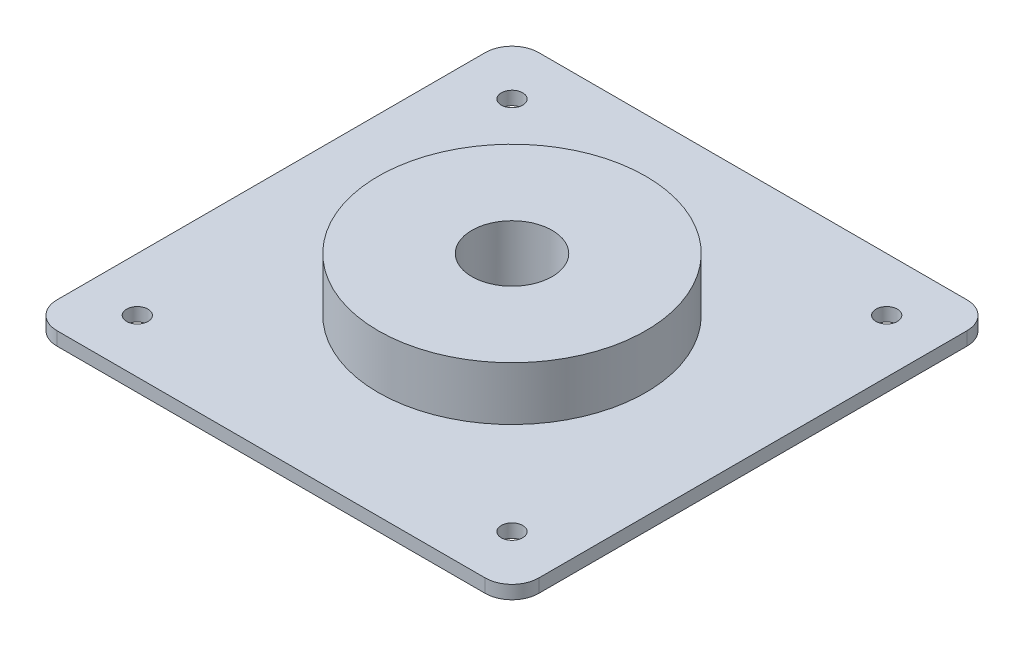
ISO-10303-21;
HEADER;
FILE_DESCRIPTION(('STEP AP214'),'2;1');
FILE_NAME('part.step','',(''),(''),'','','');
FILE_SCHEMA(('AUTOMOTIVE_DESIGN { 1 0 10303 214 1 1 1 1 }'));
ENDSEC;
DATA;
#1=APPLICATION_CONTEXT('core data for automotive mechanical design processes');
#2=APPLICATION_PROTOCOL_DEFINITION('international standard','automotive_design',2000,#1);
#3=PRODUCT_CONTEXT('',#1,'mechanical');
#4=PRODUCT('Part','Part','',(#3));
#5=PRODUCT_RELATED_PRODUCT_CATEGORY('part','',(#4));
#6=PRODUCT_DEFINITION_FORMATION('','',#4);
#7=PRODUCT_DEFINITION_CONTEXT('part definition',#1,'design');
#8=PRODUCT_DEFINITION('design','',#6,#7);
#9=PRODUCT_DEFINITION_SHAPE('','',#8);
#10=(LENGTH_UNIT() NAMED_UNIT(*) SI_UNIT(.MILLI.,.METRE.));
#11=(NAMED_UNIT(*) PLANE_ANGLE_UNIT() SI_UNIT($,.RADIAN.));
#12=(NAMED_UNIT(*) SI_UNIT($,.STERADIAN.) SOLID_ANGLE_UNIT());
#13=UNCERTAINTY_MEASURE_WITH_UNIT(LENGTH_MEASURE(1.E-05),#10,'distance_accuracy_value','');
#14=(GEOMETRIC_REPRESENTATION_CONTEXT(3) GLOBAL_UNCERTAINTY_ASSIGNED_CONTEXT((#13)) GLOBAL_UNIT_ASSIGNED_CONTEXT((#10,
#11,#12)) REPRESENTATION_CONTEXT('',''));
#15=CARTESIAN_POINT('',(0.,0.,0.));
#16=DIRECTION('',(0.,0.,1.));
#17=DIRECTION('',(1.,0.,0.));
#18=AXIS2_PLACEMENT_3D('',#15,#16,#17);
#19=CARTESIAN_POINT('',(160.,-5.,-160.));
#20=DIRECTION('',(0.,1.,0.));
#21=DIRECTION('',(0.,0.,1.));
#22=AXIS2_PLACEMENT_3D('',#19,#20,#21);
#23=CYLINDRICAL_SURFACE('',#22,4.);
#24=CARTESIAN_POINT('',(160.,0.,-160.));
#25=DIRECTION('',(0.,-1.,0.));
#26=DIRECTION('',(0.,0.,-1.));
#27=AXIS2_PLACEMENT_3D('',#24,#25,#26);
#28=CIRCLE('',#27,4.);
#29=CARTESIAN_POINT('',(160.,0.,-164.));
#30=VERTEX_POINT('',#29);
#31=EDGE_CURVE('E182',#30,#30,#28,.T.);
#32=ORIENTED_EDGE('',*,*,#31,.T.);
#33=EDGE_LOOP('',(#32));
#34=FACE_BOUND('',#33,.T.);
#35=CARTESIAN_POINT('',(160.,5.,-160.));
#36=DIRECTION('',(0.,1.,0.));
#37=DIRECTION('',(0.,0.,1.));
#38=AXIS2_PLACEMENT_3D('',#35,#36,#37);
#39=CIRCLE('',#38,4.);
#40=CARTESIAN_POINT('',(160.,5.,-156.));
#41=VERTEX_POINT('',#40);
#42=EDGE_CURVE('E48',#41,#41,#39,.T.);
#43=ORIENTED_EDGE('',*,*,#42,.T.);
#44=EDGE_LOOP('',(#43));
#45=FACE_BOUND('',#44,.T.);
#46=ADVANCED_FACE('F45',(#34,#45),#23,.F.);
#47=CARTESIAN_POINT('',(20.,-5.,-160.));
#48=DIRECTION('',(0.,1.,0.));
#49=DIRECTION('',(0.,0.,1.));
#50=AXIS2_PLACEMENT_3D('',#47,#48,#49);
#51=CYLINDRICAL_SURFACE('',#50,4.);
#52=CARTESIAN_POINT('',(20.,0.,-160.));
#53=DIRECTION('',(0.,-1.,0.));
#54=DIRECTION('',(0.,0.,-1.));
#55=AXIS2_PLACEMENT_3D('',#52,#53,#54);
#56=CIRCLE('',#55,4.);
#57=CARTESIAN_POINT('',(20.,0.,-164.));
#58=VERTEX_POINT('',#57);
#59=EDGE_CURVE('E174',#58,#58,#56,.T.);
#60=ORIENTED_EDGE('',*,*,#59,.T.);
#61=EDGE_LOOP('',(#60));
#62=FACE_BOUND('',#61,.T.);
#63=CARTESIAN_POINT('',(20.,5.,-160.));
#64=DIRECTION('',(0.,1.,0.));
#65=DIRECTION('',(0.,0.,1.));
#66=AXIS2_PLACEMENT_3D('',#63,#64,#65);
#67=CIRCLE('',#66,4.);
#68=CARTESIAN_POINT('',(20.,5.,-156.));
#69=VERTEX_POINT('',#68);
#70=EDGE_CURVE('E180',#69,#69,#67,.T.);
#71=ORIENTED_EDGE('',*,*,#70,.T.);
#72=EDGE_LOOP('',(#71));
#73=FACE_BOUND('',#72,.T.);
#74=ADVANCED_FACE('F209',(#62,#73),#51,.F.);
#75=CARTESIAN_POINT('',(170.,5.,-170.));
#76=DIRECTION('',(0.,-1.,0.));
#77=DIRECTION('',(0.,0.,-1.));
#78=AXIS2_PLACEMENT_3D('',#75,#76,#77);
#79=CYLINDRICAL_SURFACE('',#78,10.);
#80=CARTESIAN_POINT('',(170.,0.,-170.));
#81=DIRECTION('',(0.,1.,0.));
#82=DIRECTION('',(0.,0.,-1.));
#83=AXIS2_PLACEMENT_3D('',#80,#81,#82);
#84=CIRCLE('',#83,10.);
#85=CARTESIAN_POINT('',(180.,0.,-170.));
#86=VERTEX_POINT('',#85);
#87=CARTESIAN_POINT('',(170.,0.,-180.));
#88=VERTEX_POINT('',#87);
#89=EDGE_CURVE('E144',#86,#88,#84,.T.);
#90=ORIENTED_EDGE('',*,*,#89,.T.);
#91=DIRECTION('',(0.,-1.,0.));
#92=VECTOR('',#91,1.);
#93=CARTESIAN_POINT('',(170.,5.,-180.));
#94=LINE('',#93,#92);
#95=CARTESIAN_POINT('',(170.,5.,-180.));
#96=VERTEX_POINT('',#95);
#97=EDGE_CURVE('E172',#96,#88,#94,.T.);
#98=ORIENTED_EDGE('',*,*,#97,.F.);
#99=CARTESIAN_POINT('',(170.,5.,-170.));
#100=DIRECTION('',(0.,1.,0.));
#101=DIRECTION('',(0.,0.,-1.));
#102=AXIS2_PLACEMENT_3D('',#99,#100,#101);
#103=CIRCLE('',#102,10.);
#104=CARTESIAN_POINT('',(180.,5.,-170.));
#105=VERTEX_POINT('',#104);
#106=EDGE_CURVE('E159',#105,#96,#103,.T.);
#107=ORIENTED_EDGE('',*,*,#106,.F.);
#108=DIRECTION('',(0.,-1.,0.));
#109=VECTOR('',#108,1.);
#110=CARTESIAN_POINT('',(180.,5.,-170.));
#111=LINE('',#110,#109);
#112=EDGE_CURVE('E140',#105,#86,#111,.T.);
#113=ORIENTED_EDGE('',*,*,#112,.T.);
#114=EDGE_LOOP('',(#90,#98,#107,#113));
#115=FACE_BOUND('',#114,.T.);
#116=ADVANCED_FACE('F214',(#115),#79,.T.);
#117=CARTESIAN_POINT('',(10.0000000000001,5.,-180.));
#118=DIRECTION('',(0.,0.,1.));
#119=DIRECTION('',(1.,0.,0.));
#120=AXIS2_PLACEMENT_3D('',#117,#118,#119);
#121=PLANE('',#120);
#122=DIRECTION('',(-1.,0.,0.));
#123=VECTOR('',#122,1.);
#124=CARTESIAN_POINT('',(10.0000000000001,0.,-180.));
#125=LINE('',#124,#123);
#126=CARTESIAN_POINT('',(10.0000000000001,0.,-180.));
#127=VERTEX_POINT('',#126);
#128=EDGE_CURVE('E147',#88,#127,#125,.T.);
#129=ORIENTED_EDGE('',*,*,#128,.T.);
#130=DIRECTION('',(0.,-1.,0.));
#131=VECTOR('',#130,1.);
#132=CARTESIAN_POINT('',(10.0000000000001,5.,-180.));
#133=LINE('',#132,#131);
#134=CARTESIAN_POINT('',(10.0000000000001,5.,-180.));
#135=VERTEX_POINT('',#134);
#136=EDGE_CURVE('E169',#135,#127,#133,.T.);
#137=ORIENTED_EDGE('',*,*,#136,.F.);
#138=DIRECTION('',(-1.,0.,0.));
#139=VECTOR('',#138,1.);
#140=CARTESIAN_POINT('',(10.0000000000001,5.,-180.));
#141=LINE('',#140,#139);
#142=EDGE_CURVE('E106',#96,#135,#141,.T.);
#143=ORIENTED_EDGE('',*,*,#142,.F.);
#144=ORIENTED_EDGE('',*,*,#97,.T.);
#145=EDGE_LOOP('',(#129,#137,#143,#144));
#146=FACE_BOUND('',#145,.T.);
#147=ADVANCED_FACE('F219',(#146),#121,.F.);
#148=CARTESIAN_POINT('',(10.,5.,-170.));
#149=DIRECTION('',(0.,-1.,0.));
#150=DIRECTION('',(0.,0.,-1.));
#151=AXIS2_PLACEMENT_3D('',#148,#149,#150);
#152=CYLINDRICAL_SURFACE('',#151,10.);
#153=CARTESIAN_POINT('',(10.,0.,-170.));
#154=DIRECTION('',(0.,1.,0.));
#155=DIRECTION('',(0.,0.,1.));
#156=AXIS2_PLACEMENT_3D('',#153,#154,#155);
#157=CIRCLE('',#156,10.);
#158=CARTESIAN_POINT('',(0.,0.,-170.));
#159=VERTEX_POINT('',#158);
#160=EDGE_CURVE('E150',#127,#159,#157,.T.);
#161=ORIENTED_EDGE('',*,*,#160,.T.);
#162=DIRECTION('',(0.,-1.,0.));
#163=VECTOR('',#162,1.);
#164=CARTESIAN_POINT('',(0.,5.,-170.));
#165=LINE('',#164,#163);
#166=CARTESIAN_POINT('',(0.,5.,-170.));
#167=VERTEX_POINT('',#166);
#168=EDGE_CURVE('E166',#167,#159,#165,.T.);
#169=ORIENTED_EDGE('',*,*,#168,.F.);
#170=CARTESIAN_POINT('',(10.,5.,-170.));
#171=DIRECTION('',(0.,1.,0.));
#172=DIRECTION('',(0.,0.,1.));
#173=AXIS2_PLACEMENT_3D('',#170,#171,#172);
#174=CIRCLE('',#173,10.);
#175=EDGE_CURVE('E333',#135,#167,#174,.T.);
#176=ORIENTED_EDGE('',*,*,#175,.F.);
#177=ORIENTED_EDGE('',*,*,#136,.T.);
#178=EDGE_LOOP('',(#161,#169,#176,#177));
#179=FACE_BOUND('',#178,.T.);
#180=ADVANCED_FACE('F226',(#179),#152,.T.);
#181=CARTESIAN_POINT('',(0.,5.,-10.0000000000001));
#182=DIRECTION('',(1.,0.,0.));
#183=DIRECTION('',(0.,0.,-1.));
#184=AXIS2_PLACEMENT_3D('',#181,#182,#183);
#185=PLANE('',#184);
#186=DIRECTION('',(0.,0.,1.));
#187=VECTOR('',#186,1.);
#188=CARTESIAN_POINT('',(0.,0.,-10.0000000000001));
#189=LINE('',#188,#187);
#190=CARTESIAN_POINT('',(0.,0.,-10.0000000000001));
#191=VERTEX_POINT('',#190);
#192=EDGE_CURVE('E152',#159,#191,#189,.T.);
#193=ORIENTED_EDGE('',*,*,#192,.T.);
#194=DIRECTION('',(0.,-1.,0.));
#195=VECTOR('',#194,1.);
#196=CARTESIAN_POINT('',(0.,5.,-10.0000000000001));
#197=LINE('',#196,#195);
#198=CARTESIAN_POINT('',(0.,5.,-10.0000000000001));
#199=VERTEX_POINT('',#198);
#200=EDGE_CURVE('E163',#199,#191,#197,.T.);
#201=ORIENTED_EDGE('',*,*,#200,.F.);
#202=DIRECTION('',(0.,0.,1.));
#203=VECTOR('',#202,1.);
#204=CARTESIAN_POINT('',(0.,5.,-10.0000000000001));
#205=LINE('',#204,#203);
#206=EDGE_CURVE('E335',#167,#199,#205,.T.);
#207=ORIENTED_EDGE('',*,*,#206,.F.);
#208=ORIENTED_EDGE('',*,*,#168,.T.);
#209=EDGE_LOOP('',(#193,#201,#207,#208));
#210=FACE_BOUND('',#209,.T.);
#211=ADVANCED_FACE('F229',(#210),#185,.F.);
#212=CARTESIAN_POINT('',(10.,5.,-10.));
#213=DIRECTION('',(0.,-1.,0.));
#214=DIRECTION('',(0.,0.,-1.));
#215=AXIS2_PLACEMENT_3D('',#212,#213,#214);
#216=CYLINDRICAL_SURFACE('',#215,10.);
#217=CARTESIAN_POINT('',(10.,0.,-10.));
#218=DIRECTION('',(0.,1.,0.));
#219=DIRECTION('',(0.,0.,-1.));
#220=AXIS2_PLACEMENT_3D('',#217,#218,#219);
#221=CIRCLE('',#220,10.);
#222=CARTESIAN_POINT('',(10.0000000000001,0.,0.));
#223=VERTEX_POINT('',#222);
#224=EDGE_CURVE('E154',#191,#223,#221,.T.);
#225=ORIENTED_EDGE('',*,*,#224,.T.);
#226=DIRECTION('',(0.,-1.,0.));
#227=VECTOR('',#226,1.);
#228=CARTESIAN_POINT('',(10.0000000000001,5.,0.));
#229=LINE('',#228,#227);
#230=CARTESIAN_POINT('',(10.0000000000001,5.,0.));
#231=VERTEX_POINT('',#230);
#232=EDGE_CURVE('E135',#231,#223,#229,.T.);
#233=ORIENTED_EDGE('',*,*,#232,.F.);
#234=CARTESIAN_POINT('',(10.,5.,-10.));
#235=DIRECTION('',(0.,1.,0.));
#236=DIRECTION('',(0.,0.,-1.));
#237=AXIS2_PLACEMENT_3D('',#234,#235,#236);
#238=CIRCLE('',#237,10.);
#239=EDGE_CURVE('E126',#199,#231,#238,.T.);
#240=ORIENTED_EDGE('',*,*,#239,.F.);
#241=ORIENTED_EDGE('',*,*,#200,.T.);
#242=EDGE_LOOP('',(#225,#233,#240,#241));
#243=FACE_BOUND('',#242,.T.);
#244=ADVANCED_FACE('F233',(#243),#216,.T.);
#245=CARTESIAN_POINT('',(10.0000000000001,5.,0.));
#246=DIRECTION('',(0.,0.,-1.));
#247=DIRECTION('',(-1.,0.,0.));
#248=AXIS2_PLACEMENT_3D('',#245,#246,#247);
#249=PLANE('',#248);
#250=DIRECTION('',(1.,0.,0.));
#251=VECTOR('',#250,1.);
#252=CARTESIAN_POINT('',(10.0000000000001,0.,0.));
#253=LINE('',#252,#251);
#254=CARTESIAN_POINT('',(170.,0.,0.));
#255=VERTEX_POINT('',#254);
#256=EDGE_CURVE('E134',#223,#255,#253,.T.);
#257=ORIENTED_EDGE('',*,*,#256,.T.);
#258=DIRECTION('',(0.,-1.,0.));
#259=VECTOR('',#258,1.);
#260=CARTESIAN_POINT('',(170.,5.,0.));
#261=LINE('',#260,#259);
#262=CARTESIAN_POINT('',(170.,5.,0.));
#263=VERTEX_POINT('',#262);
#264=EDGE_CURVE('E131',#263,#255,#261,.T.);
#265=ORIENTED_EDGE('',*,*,#264,.F.);
#266=DIRECTION('',(1.,0.,0.));
#267=VECTOR('',#266,1.);
#268=CARTESIAN_POINT('',(10.0000000000001,5.,0.));
#269=LINE('',#268,#267);
#270=EDGE_CURVE('E119',#231,#263,#269,.T.);
#271=ORIENTED_EDGE('',*,*,#270,.F.);
#272=ORIENTED_EDGE('',*,*,#232,.T.);
#273=EDGE_LOOP('',(#257,#265,#271,#272));
#274=FACE_BOUND('',#273,.T.);
#275=ADVANCED_FACE('F132',(#274),#249,.F.);
#276=CARTESIAN_POINT('',(170.,5.,-10.));
#277=DIRECTION('',(0.,-1.,0.));
#278=DIRECTION('',(0.,0.,-1.));
#279=AXIS2_PLACEMENT_3D('',#276,#277,#278);
#280=CYLINDRICAL_SURFACE('',#279,10.);
#281=CARTESIAN_POINT('',(170.,0.,-10.));
#282=DIRECTION('',(0.,1.,0.));
#283=DIRECTION('',(0.,0.,-1.));
#284=AXIS2_PLACEMENT_3D('',#281,#282,#283);
#285=CIRCLE('',#284,10.);
#286=CARTESIAN_POINT('',(180.,0.,-10.0000000000001));
#287=VERTEX_POINT('',#286);
#288=EDGE_CURVE('E91',#255,#287,#285,.T.);
#289=ORIENTED_EDGE('',*,*,#288,.T.);
#290=DIRECTION('',(0.,-1.,0.));
#291=VECTOR('',#290,1.);
#292=CARTESIAN_POINT('',(180.,5.,-10.0000000000001));
#293=LINE('',#292,#291);
#294=CARTESIAN_POINT('',(180.,5.,-10.0000000000001));
#295=VERTEX_POINT('',#294);
#296=EDGE_CURVE('E136',#295,#287,#293,.T.);
#297=ORIENTED_EDGE('',*,*,#296,.F.);
#298=CARTESIAN_POINT('',(170.,5.,-10.));
#299=DIRECTION('',(0.,1.,0.));
#300=DIRECTION('',(0.,0.,-1.));
#301=AXIS2_PLACEMENT_3D('',#298,#299,#300);
#302=CIRCLE('',#301,10.);
#303=EDGE_CURVE('E124',#263,#295,#302,.T.);
#304=ORIENTED_EDGE('',*,*,#303,.F.);
#305=ORIENTED_EDGE('',*,*,#264,.T.);
#306=EDGE_LOOP('',(#289,#297,#304,#305));
#307=FACE_BOUND('',#306,.T.);
#308=ADVANCED_FACE('F138',(#307),#280,.T.);
#309=CARTESIAN_POINT('',(180.,5.,-170.));
#310=DIRECTION('',(-1.,0.,0.));
#311=DIRECTION('',(0.,0.,1.));
#312=AXIS2_PLACEMENT_3D('',#309,#310,#311);
#313=PLANE('',#312);
#314=DIRECTION('',(0.,0.,-1.));
#315=VECTOR('',#314,1.);
#316=CARTESIAN_POINT('',(180.,0.,-170.));
#317=LINE('',#316,#315);
#318=EDGE_CURVE('E97',#287,#86,#317,.T.);
#319=ORIENTED_EDGE('',*,*,#318,.T.);
#320=ORIENTED_EDGE('',*,*,#112,.F.);
#321=DIRECTION('',(0.,0.,-1.));
#322=VECTOR('',#321,1.);
#323=CARTESIAN_POINT('',(180.,5.,-170.));
#324=LINE('',#323,#322);
#325=EDGE_CURVE('E62',#295,#105,#324,.T.);
#326=ORIENTED_EDGE('',*,*,#325,.F.);
#327=ORIENTED_EDGE('',*,*,#296,.T.);
#328=EDGE_LOOP('',(#319,#320,#326,#327));
#329=FACE_BOUND('',#328,.T.);
#330=ADVANCED_FACE('F192',(#329),#313,.F.);
#331=CARTESIAN_POINT('',(170.,5.,-170.));
#332=DIRECTION('',(0.,-1.,0.));
#333=DIRECTION('',(0.,0.,-1.));
#334=AXIS2_PLACEMENT_3D('',#331,#332,#333);
#335=PLANE('',#334);
#336=CARTESIAN_POINT('',(90.,5.,-90.));
#337=DIRECTION('',(0.,1.,0.));
#338=DIRECTION('',(0.,0.,1.));
#339=AXIS2_PLACEMENT_3D('',#336,#337,#338);
#340=CIRCLE('',#339,50.);
#341=CARTESIAN_POINT('',(90.,5.,-40.));
#342=VERTEX_POINT('',#341);
#343=EDGE_CURVE('E11',#342,#342,#340,.T.);
#344=ORIENTED_EDGE('',*,*,#343,.F.);
#345=EDGE_LOOP('',(#344));
#346=FACE_BOUND('',#345,.T.);
#347=CARTESIAN_POINT('',(160.,5.,-20.));
#348=DIRECTION('',(0.,1.,0.));
#349=DIRECTION('',(0.,0.,1.));
#350=AXIS2_PLACEMENT_3D('',#347,#348,#349);
#351=CIRCLE('',#350,4.);
#352=CARTESIAN_POINT('',(160.,5.,-16.));
#353=VERTEX_POINT('',#352);
#354=EDGE_CURVE('E326',#353,#353,#351,.T.);
#355=ORIENTED_EDGE('',*,*,#354,.F.);
#356=EDGE_LOOP('',(#355));
#357=FACE_BOUND('',#356,.T.);
#358=CARTESIAN_POINT('',(20.,5.,-20.));
#359=DIRECTION('',(0.,1.,0.));
#360=DIRECTION('',(0.,0.,1.));
#361=AXIS2_PLACEMENT_3D('',#358,#359,#360);
#362=CIRCLE('',#361,4.);
#363=CARTESIAN_POINT('',(20.,5.,-16.));
#364=VERTEX_POINT('',#363);
#365=EDGE_CURVE('E177',#364,#364,#362,.T.);
#366=ORIENTED_EDGE('',*,*,#365,.F.);
#367=EDGE_LOOP('',(#366));
#368=FACE_BOUND('',#367,.T.);
#369=ORIENTED_EDGE('',*,*,#106,.T.);
#370=ORIENTED_EDGE('',*,*,#142,.T.);
#371=ORIENTED_EDGE('',*,*,#175,.T.);
#372=ORIENTED_EDGE('',*,*,#206,.T.);
#373=ORIENTED_EDGE('',*,*,#239,.T.);
#374=ORIENTED_EDGE('',*,*,#270,.T.);
#375=ORIENTED_EDGE('',*,*,#303,.T.);
#376=ORIENTED_EDGE('',*,*,#325,.T.);
#377=EDGE_LOOP('',(#369,#370,#371,#372,#373,#374,#375,#376));
#378=FACE_BOUND('',#377,.T.);
#379=ORIENTED_EDGE('',*,*,#70,.F.);
#380=EDGE_LOOP('',(#379));
#381=FACE_BOUND('',#380,.T.);
#382=ORIENTED_EDGE('',*,*,#42,.F.);
#383=EDGE_LOOP('',(#382));
#384=FACE_BOUND('',#383,.T.);
#385=ADVANCED_FACE('F121',(#346,#357,#368,#378,#381,#384),#335,.F.);
#386=CARTESIAN_POINT('',(170.,0.,-170.));
#387=DIRECTION('',(0.,-1.,0.));
#388=DIRECTION('',(0.,0.,-1.));
#389=AXIS2_PLACEMENT_3D('',#386,#387,#388);
#390=PLANE('',#389);
#391=CARTESIAN_POINT('',(90.,0.,-90.));
#392=DIRECTION('',(0.,-1.,0.));
#393=DIRECTION('',(0.,0.,-1.));
#394=AXIS2_PLACEMENT_3D('',#391,#392,#393);
#395=CIRCLE('',#394,15.);
#396=CARTESIAN_POINT('',(90.,0.,-105.));
#397=VERTEX_POINT('',#396);
#398=EDGE_CURVE('E313',#397,#397,#395,.T.);
#399=ORIENTED_EDGE('',*,*,#398,.F.);
#400=EDGE_LOOP('',(#399));
#401=FACE_BOUND('',#400,.T.);
#402=CARTESIAN_POINT('',(160.,0.,-20.));
#403=DIRECTION('',(0.,-1.,0.));
#404=DIRECTION('',(0.,0.,-1.));
#405=AXIS2_PLACEMENT_3D('',#402,#403,#404);
#406=CIRCLE('',#405,4.);
#407=CARTESIAN_POINT('',(160.,0.,-24.));
#408=VERTEX_POINT('',#407);
#409=EDGE_CURVE('E322',#408,#408,#406,.T.);
#410=ORIENTED_EDGE('',*,*,#409,.F.);
#411=EDGE_LOOP('',(#410));
#412=FACE_BOUND('',#411,.T.);
#413=CARTESIAN_POINT('',(20.,0.,-20.));
#414=DIRECTION('',(0.,-1.,0.));
#415=DIRECTION('',(0.,0.,-1.));
#416=AXIS2_PLACEMENT_3D('',#413,#414,#415);
#417=CIRCLE('',#416,4.);
#418=CARTESIAN_POINT('',(20.,0.,-24.));
#419=VERTEX_POINT('',#418);
#420=EDGE_CURVE('E148',#419,#419,#417,.T.);
#421=ORIENTED_EDGE('',*,*,#420,.F.);
#422=EDGE_LOOP('',(#421));
#423=FACE_BOUND('',#422,.T.);
#424=ORIENTED_EDGE('',*,*,#89,.F.);
#425=ORIENTED_EDGE('',*,*,#318,.F.);
#426=ORIENTED_EDGE('',*,*,#288,.F.);
#427=ORIENTED_EDGE('',*,*,#256,.F.);
#428=ORIENTED_EDGE('',*,*,#224,.F.);
#429=ORIENTED_EDGE('',*,*,#192,.F.);
#430=ORIENTED_EDGE('',*,*,#160,.F.);
#431=ORIENTED_EDGE('',*,*,#128,.F.);
#432=EDGE_LOOP('',(#424,#425,#426,#427,#428,#429,#430,#431));
#433=FACE_BOUND('',#432,.T.);
#434=ORIENTED_EDGE('',*,*,#59,.F.);
#435=EDGE_LOOP('',(#434));
#436=FACE_BOUND('',#435,.T.);
#437=ORIENTED_EDGE('',*,*,#31,.F.);
#438=EDGE_LOOP('',(#437));
#439=FACE_BOUND('',#438,.T.);
#440=ADVANCED_FACE('F191',(#401,#412,#423,#433,#436,#439),#390,.T.);
#441=CARTESIAN_POINT('',(20.,-5.,-20.));
#442=DIRECTION('',(0.,1.,0.));
#443=DIRECTION('',(0.,0.,1.));
#444=AXIS2_PLACEMENT_3D('',#441,#442,#443);
#445=CYLINDRICAL_SURFACE('',#444,4.);
#446=ORIENTED_EDGE('',*,*,#420,.T.);
#447=EDGE_LOOP('',(#446));
#448=FACE_BOUND('',#447,.T.);
#449=ORIENTED_EDGE('',*,*,#365,.T.);
#450=EDGE_LOOP('',(#449));
#451=FACE_BOUND('',#450,.T.);
#452=ADVANCED_FACE('F200',(#448,#451),#445,.F.);
#453=CARTESIAN_POINT('',(160.,-5.,-20.));
#454=DIRECTION('',(0.,1.,0.));
#455=DIRECTION('',(0.,0.,1.));
#456=AXIS2_PLACEMENT_3D('',#453,#454,#455);
#457=CYLINDRICAL_SURFACE('',#456,4.);
#458=ORIENTED_EDGE('',*,*,#409,.T.);
#459=EDGE_LOOP('',(#458));
#460=FACE_BOUND('',#459,.T.);
#461=ORIENTED_EDGE('',*,*,#354,.T.);
#462=EDGE_LOOP('',(#461));
#463=FACE_BOUND('',#462,.T.);
#464=ADVANCED_FACE('F255',(#460,#463),#457,.F.);
#465=CARTESIAN_POINT('',(90.,25.,-90.));
#466=DIRECTION('',(0.,-1.,0.));
#467=DIRECTION('',(0.,0.,-1.));
#468=AXIS2_PLACEMENT_3D('',#465,#466,#467);
#469=CYLINDRICAL_SURFACE('',#468,50.);
#470=CARTESIAN_POINT('',(90.,25.,-90.));
#471=DIRECTION('',(0.,1.,0.));
#472=DIRECTION('',(0.,0.,1.));
#473=AXIS2_PLACEMENT_3D('',#470,#471,#472);
#474=CIRCLE('',#473,50.);
#475=CARTESIAN_POINT('',(90.,25.,-40.));
#476=VERTEX_POINT('',#475);
#477=EDGE_CURVE('E318',#476,#476,#474,.T.);
#478=ORIENTED_EDGE('',*,*,#477,.F.);
#479=EDGE_LOOP('',(#478));
#480=FACE_BOUND('',#479,.T.);
#481=ORIENTED_EDGE('',*,*,#343,.T.);
#482=EDGE_LOOP('',(#481));
#483=FACE_BOUND('',#482,.T.);
#484=ADVANCED_FACE('F279',(#480,#483),#469,.T.);
#485=CARTESIAN_POINT('',(90.,25.,-90.));
#486=DIRECTION('',(0.,1.,0.));
#487=DIRECTION('',(0.,0.,1.));
#488=AXIS2_PLACEMENT_3D('',#485,#486,#487);
#489=PLANE('',#488);
#490=CARTESIAN_POINT('',(90.,25.,-90.));
#491=DIRECTION('',(0.,1.,0.));
#492=DIRECTION('',(0.,0.,1.));
#493=AXIS2_PLACEMENT_3D('',#490,#491,#492);
#494=CIRCLE('',#493,15.);
#495=CARTESIAN_POINT('',(90.,25.,-75.));
#496=VERTEX_POINT('',#495);
#497=EDGE_CURVE('E316',#496,#496,#494,.T.);
#498=ORIENTED_EDGE('',*,*,#497,.F.);
#499=EDGE_LOOP('',(#498));
#500=FACE_BOUND('',#499,.T.);
#501=ORIENTED_EDGE('',*,*,#477,.T.);
#502=EDGE_LOOP('',(#501));
#503=FACE_BOUND('',#502,.T.);
#504=ADVANCED_FACE('F287',(#500,#503),#489,.T.);
#505=CARTESIAN_POINT('',(90.,-25.,-90.));
#506=DIRECTION('',(0.,1.,0.));
#507=DIRECTION('',(0.,0.,1.));
#508=AXIS2_PLACEMENT_3D('',#505,#506,#507);
#509=CYLINDRICAL_SURFACE('',#508,15.);
#510=ORIENTED_EDGE('',*,*,#398,.T.);
#511=EDGE_LOOP('',(#510));
#512=FACE_BOUND('',#511,.T.);
#513=ORIENTED_EDGE('',*,*,#497,.T.);
#514=EDGE_LOOP('',(#513));
#515=FACE_BOUND('',#514,.T.);
#516=ADVANCED_FACE('F297',(#512,#515),#509,.F.);
#517=CLOSED_SHELL('',(#46,#74,#116,#147,#180,#211,#244,#275,#308,#330,#385,#440,#452,#464,#484,
#504,#516));
#518=MANIFOLD_SOLID_BREP('B2',#517);
#519=ADVANCED_BREP_SHAPE_REPRESENTATION('',(#18,#518),#14);
#520=SHAPE_DEFINITION_REPRESENTATION(#9,#519);
ENDSEC;
END-ISO-10303-21;
